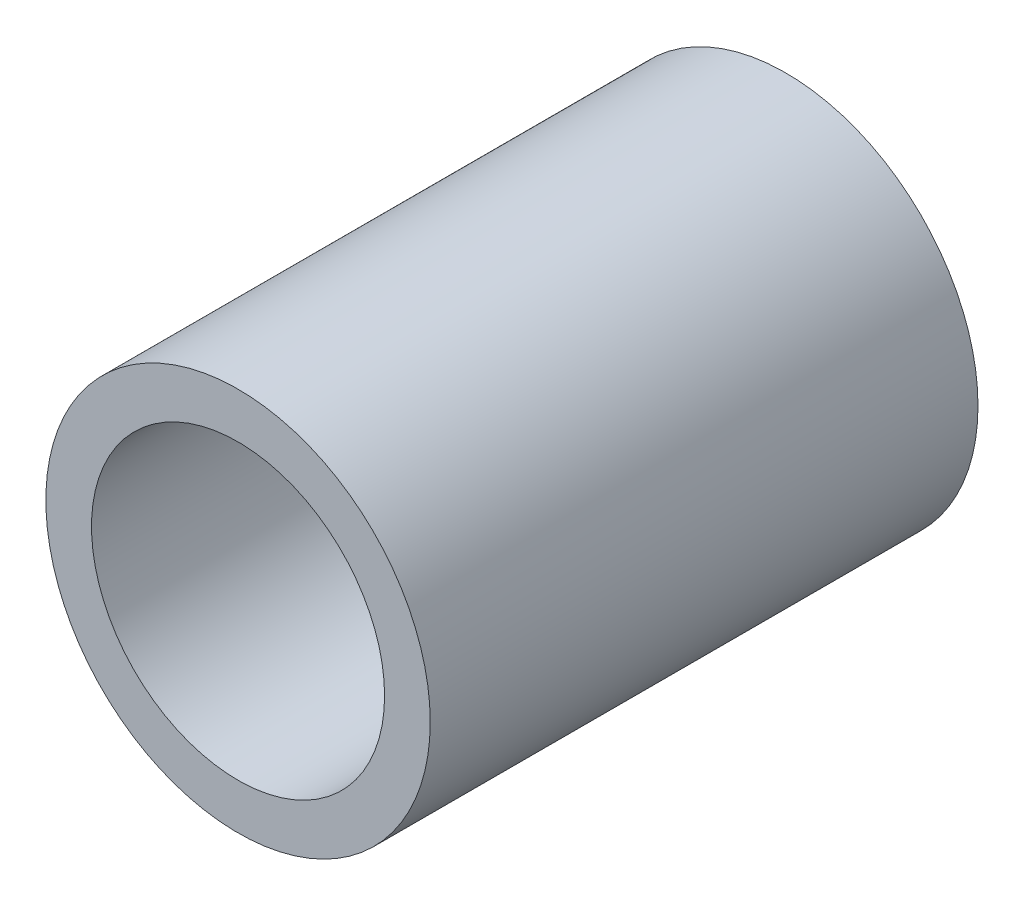
ISO-10303-21;
HEADER;
FILE_DESCRIPTION(('STEP AP214'),'2;1');
FILE_NAME('part.step','',(''),(''),'','','');
FILE_SCHEMA(('AUTOMOTIVE_DESIGN { 1 0 10303 214 1 1 1 1 }'));
ENDSEC;
DATA;
#1=APPLICATION_CONTEXT('core data for automotive mechanical design processes');
#2=APPLICATION_PROTOCOL_DEFINITION('international standard','automotive_design',2000,#1);
#3=PRODUCT_CONTEXT('',#1,'mechanical');
#4=PRODUCT('Part','Part','',(#3));
#5=PRODUCT_RELATED_PRODUCT_CATEGORY('part','',(#4));
#6=PRODUCT_DEFINITION_FORMATION('','',#4);
#7=PRODUCT_DEFINITION_CONTEXT('part definition',#1,'design');
#8=PRODUCT_DEFINITION('design','',#6,#7);
#9=PRODUCT_DEFINITION_SHAPE('','',#8);
#10=(LENGTH_UNIT() NAMED_UNIT(*) SI_UNIT(.MILLI.,.METRE.));
#11=(NAMED_UNIT(*) PLANE_ANGLE_UNIT() SI_UNIT($,.RADIAN.));
#12=(NAMED_UNIT(*) SI_UNIT($,.STERADIAN.) SOLID_ANGLE_UNIT());
#13=UNCERTAINTY_MEASURE_WITH_UNIT(LENGTH_MEASURE(1.E-05),#10,'distance_accuracy_value','');
#14=(GEOMETRIC_REPRESENTATION_CONTEXT(3) GLOBAL_UNCERTAINTY_ASSIGNED_CONTEXT((#13)) GLOBAL_UNIT_ASSIGNED_CONTEXT((#10,
#11,#12)) REPRESENTATION_CONTEXT('',''));
#15=CARTESIAN_POINT('',(0.,0.,0.));
#16=DIRECTION('',(0.,0.,1.));
#17=DIRECTION('',(1.,0.,0.));
#18=AXIS2_PLACEMENT_3D('',#15,#16,#17);
#19=CARTESIAN_POINT('',(0.,0.,5.7));
#20=DIRECTION('',(0.,0.,1.));
#21=DIRECTION('',(1.,0.,0.));
#22=AXIS2_PLACEMENT_3D('',#19,#20,#21);
#23=PLANE('',#22);
#24=CARTESIAN_POINT('',(0.,0.,5.7));
#25=DIRECTION('',(0.,0.,1.));
#26=DIRECTION('',(1.,0.,0.));
#27=AXIS2_PLACEMENT_3D('',#24,#25,#26);
#28=CIRCLE('',#27,2.);
#29=CARTESIAN_POINT('',(2.,0.,5.7));
#30=VERTEX_POINT('',#29);
#31=EDGE_CURVE('E10',#30,#30,#28,.T.);
#32=ORIENTED_EDGE('',*,*,#31,.T.);
#33=EDGE_LOOP('',(#32));
#34=FACE_BOUND('',#33,.T.);
#35=CARTESIAN_POINT('',(0.,0.,5.7));
#36=DIRECTION('',(0.,0.,1.));
#37=DIRECTION('',(1.,0.,0.));
#38=AXIS2_PLACEMENT_3D('',#35,#36,#37);
#39=CIRCLE('',#38,1.525);
#40=CARTESIAN_POINT('',(1.525,0.,5.7));
#41=VERTEX_POINT('',#40);
#42=EDGE_CURVE('E48',#41,#41,#39,.T.);
#43=ORIENTED_EDGE('',*,*,#42,.F.);
#44=EDGE_LOOP('',(#43));
#45=FACE_BOUND('',#44,.T.);
#46=ADVANCED_FACE('F40',(#34,#45),#23,.T.);
#47=CARTESIAN_POINT('',(0.,0.,0.));
#48=DIRECTION('',(0.,0.,1.));
#49=DIRECTION('',(1.,0.,0.));
#50=AXIS2_PLACEMENT_3D('',#47,#48,#49);
#51=PLANE('',#50);
#52=CARTESIAN_POINT('',(0.,0.,0.));
#53=DIRECTION('',(0.,0.,1.));
#54=DIRECTION('',(1.,0.,0.));
#55=AXIS2_PLACEMENT_3D('',#52,#53,#54);
#56=CIRCLE('',#55,2.);
#57=CARTESIAN_POINT('',(2.,0.,0.));
#58=VERTEX_POINT('',#57);
#59=EDGE_CURVE('E41',#58,#58,#56,.T.);
#60=ORIENTED_EDGE('',*,*,#59,.F.);
#61=EDGE_LOOP('',(#60));
#62=FACE_BOUND('',#61,.T.);
#63=CARTESIAN_POINT('',(0.,0.,0.));
#64=DIRECTION('',(0.,0.,1.));
#65=DIRECTION('',(1.,0.,0.));
#66=AXIS2_PLACEMENT_3D('',#63,#64,#65);
#67=CIRCLE('',#66,1.525);
#68=CARTESIAN_POINT('',(1.525,0.,0.));
#69=VERTEX_POINT('',#68);
#70=EDGE_CURVE('E49',#69,#69,#67,.T.);
#71=ORIENTED_EDGE('',*,*,#70,.T.);
#72=EDGE_LOOP('',(#71));
#73=FACE_BOUND('',#72,.T.);
#74=ADVANCED_FACE('F58',(#62,#73),#51,.F.);
#75=CARTESIAN_POINT('',(0.,0.,5.7));
#76=DIRECTION('',(0.,0.,-1.));
#77=DIRECTION('',(-1.,0.,0.));
#78=AXIS2_PLACEMENT_3D('',#75,#76,#77);
#79=CYLINDRICAL_SURFACE('',#78,2.);
#80=ORIENTED_EDGE('',*,*,#31,.F.);
#81=EDGE_LOOP('',(#80));
#82=FACE_BOUND('',#81,.T.);
#83=ORIENTED_EDGE('',*,*,#59,.T.);
#84=EDGE_LOOP('',(#83));
#85=FACE_BOUND('',#84,.T.);
#86=ADVANCED_FACE('F39',(#82,#85),#79,.T.);
#87=CARTESIAN_POINT('',(0.,0.,5.7));
#88=DIRECTION('',(0.,0.,-1.));
#89=DIRECTION('',(-1.,0.,0.));
#90=AXIS2_PLACEMENT_3D('',#87,#88,#89);
#91=CYLINDRICAL_SURFACE('',#90,1.525);
#92=ORIENTED_EDGE('',*,*,#42,.T.);
#93=EDGE_LOOP('',(#92));
#94=FACE_BOUND('',#93,.T.);
#95=ORIENTED_EDGE('',*,*,#70,.F.);
#96=EDGE_LOOP('',(#95));
#97=FACE_BOUND('',#96,.T.);
#98=ADVANCED_FACE('F57',(#94,#97),#91,.F.);
#99=CLOSED_SHELL('',(#46,#74,#86,#98));
#100=MANIFOLD_SOLID_BREP('B2',#99);
#101=ADVANCED_BREP_SHAPE_REPRESENTATION('',(#18,#100),#14);
#102=SHAPE_DEFINITION_REPRESENTATION(#9,#101);
ENDSEC;
END-ISO-10303-21;
